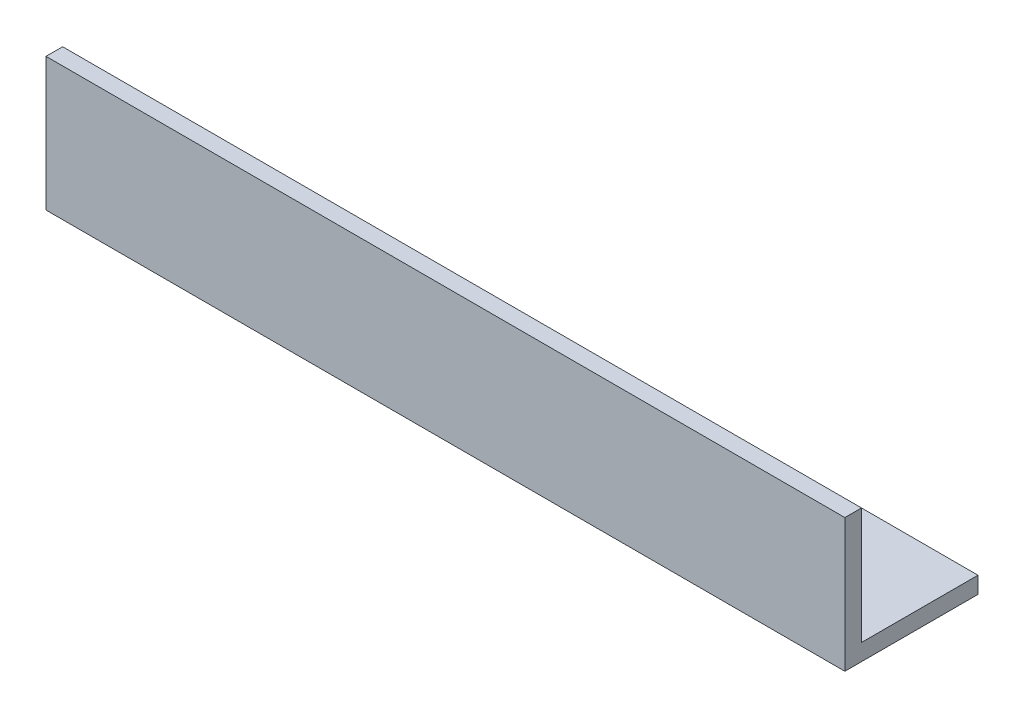
ISO-10303-21;
HEADER;
FILE_DESCRIPTION(('STEP AP214'),'2;1');
FILE_NAME('part.step','',(''),(''),'','','');
FILE_SCHEMA(('AUTOMOTIVE_DESIGN { 1 0 10303 214 1 1 1 1 }'));
ENDSEC;
DATA;
#1=APPLICATION_CONTEXT('core data for automotive mechanical design processes');
#2=APPLICATION_PROTOCOL_DEFINITION('international standard','automotive_design',2000,#1);
#3=PRODUCT_CONTEXT('',#1,'mechanical');
#4=PRODUCT('Part','Part','',(#3));
#5=PRODUCT_RELATED_PRODUCT_CATEGORY('part','',(#4));
#6=PRODUCT_DEFINITION_FORMATION('','',#4);
#7=PRODUCT_DEFINITION_CONTEXT('part definition',#1,'design');
#8=PRODUCT_DEFINITION('design','',#6,#7);
#9=PRODUCT_DEFINITION_SHAPE('','',#8);
#10=(LENGTH_UNIT() NAMED_UNIT(*) SI_UNIT(.MILLI.,.METRE.));
#11=(NAMED_UNIT(*) PLANE_ANGLE_UNIT() SI_UNIT($,.RADIAN.));
#12=(NAMED_UNIT(*) SI_UNIT($,.STERADIAN.) SOLID_ANGLE_UNIT());
#13=UNCERTAINTY_MEASURE_WITH_UNIT(LENGTH_MEASURE(1.E-05),#10,'distance_accuracy_value','');
#14=(GEOMETRIC_REPRESENTATION_CONTEXT(3) GLOBAL_UNCERTAINTY_ASSIGNED_CONTEXT((#13)) GLOBAL_UNIT_ASSIGNED_CONTEXT((#10,
#11,#12)) REPRESENTATION_CONTEXT('',''));
#15=CARTESIAN_POINT('',(0.,0.,0.));
#16=DIRECTION('',(0.,0.,1.));
#17=DIRECTION('',(1.,0.,0.));
#18=AXIS2_PLACEMENT_3D('',#15,#16,#17);
#19=CARTESIAN_POINT('',(304.8,0.,0.));
#20=DIRECTION('',(0.,0.,-1.));
#21=DIRECTION('',(-1.,0.,0.));
#22=AXIS2_PLACEMENT_3D('',#19,#20,#21);
#23=PLANE('',#22);
#24=DIRECTION('',(0.,-1.,0.));
#25=VECTOR('',#24,1.);
#26=CARTESIAN_POINT('',(0.,0.,0.));
#27=LINE('',#26,#25);
#28=CARTESIAN_POINT('',(0.,50.8,0.));
#29=VERTEX_POINT('',#28);
#30=CARTESIAN_POINT('',(0.,0.,0.));
#31=VERTEX_POINT('',#30);
#32=EDGE_CURVE('E171',#29,#31,#27,.T.);
#33=ORIENTED_EDGE('',*,*,#32,.T.);
#34=DIRECTION('',(-1.,0.,0.));
#35=VECTOR('',#34,1.);
#36=CARTESIAN_POINT('',(304.8,0.,0.));
#37=LINE('',#36,#35);
#38=CARTESIAN_POINT('',(304.8,0.,0.));
#39=VERTEX_POINT('',#38);
#40=EDGE_CURVE('E11',#39,#31,#37,.T.);
#41=ORIENTED_EDGE('',*,*,#40,.F.);
#42=DIRECTION('',(0.,-1.,0.));
#43=VECTOR('',#42,1.);
#44=CARTESIAN_POINT('',(304.8,0.,0.));
#45=LINE('',#44,#43);
#46=CARTESIAN_POINT('',(304.8,50.8,0.));
#47=VERTEX_POINT('',#46);
#48=EDGE_CURVE('E204',#47,#39,#45,.T.);
#49=ORIENTED_EDGE('',*,*,#48,.F.);
#50=DIRECTION('',(-1.,0.,0.));
#51=VECTOR('',#50,1.);
#52=CARTESIAN_POINT('',(304.8,50.8,0.));
#53=LINE('',#52,#51);
#54=EDGE_CURVE('E218',#47,#29,#53,.T.);
#55=ORIENTED_EDGE('',*,*,#54,.T.);
#56=EDGE_LOOP('',(#33,#41,#49,#55));
#57=FACE_BOUND('',#56,.T.);
#58=ADVANCED_FACE('F33',(#57),#23,.F.);
#59=CARTESIAN_POINT('',(304.8,0.,0.));
#60=DIRECTION('',(0.,1.,0.));
#61=DIRECTION('',(0.,0.,1.));
#62=AXIS2_PLACEMENT_3D('',#59,#60,#61);
#63=PLANE('',#62);
#64=DIRECTION('',(0.,0.,-1.));
#65=VECTOR('',#64,1.);
#66=CARTESIAN_POINT('',(53.975,0.,-42.8625));
#67=LINE('',#66,#65);
#68=CARTESIAN_POINT('',(53.975,0.,-17.4625));
#69=VERTEX_POINT('',#68);
#70=CARTESIAN_POINT('',(53.975,0.,-42.8625));
#71=VERTEX_POINT('',#70);
#72=EDGE_CURVE('E145',#69,#71,#67,.T.);
#73=ORIENTED_EDGE('',*,*,#72,.T.);
#74=CARTESIAN_POINT('',(50.8,0.,-42.8625));
#75=DIRECTION('',(0.,1.,0.));
#76=DIRECTION('',(0.,0.,1.));
#77=AXIS2_PLACEMENT_3D('',#74,#75,#76);
#78=CIRCLE('',#77,3.175);
#79=CARTESIAN_POINT('',(47.625,0.,-42.8625));
#80=VERTEX_POINT('',#79);
#81=EDGE_CURVE('E137',#71,#80,#78,.T.);
#82=ORIENTED_EDGE('',*,*,#81,.T.);
#83=DIRECTION('',(0.,0.,1.));
#84=VECTOR('',#83,1.);
#85=CARTESIAN_POINT('',(47.625,0.,-42.8625));
#86=LINE('',#85,#84);
#87=CARTESIAN_POINT('',(47.625,0.,-17.4625));
#88=VERTEX_POINT('',#87);
#89=EDGE_CURVE('E148',#80,#88,#86,.T.);
#90=ORIENTED_EDGE('',*,*,#89,.T.);
#91=CARTESIAN_POINT('',(50.8,0.,-17.4625));
#92=DIRECTION('',(0.,1.,0.));
#93=DIRECTION('',(0.,0.,1.));
#94=AXIS2_PLACEMENT_3D('',#91,#92,#93);
#95=CIRCLE('',#94,3.17499999999999);
#96=EDGE_CURVE('E47',#88,#69,#95,.T.);
#97=ORIENTED_EDGE('',*,*,#96,.T.);
#98=EDGE_LOOP('',(#73,#82,#90,#97));
#99=FACE_BOUND('',#98,.T.);
#100=DIRECTION('',(0.,0.,-1.));
#101=VECTOR('',#100,1.);
#102=CARTESIAN_POINT('',(257.175,0.,-42.8625));
#103=LINE('',#102,#101);
#104=CARTESIAN_POINT('',(257.175,0.,-17.4625));
#105=VERTEX_POINT('',#104);
#106=CARTESIAN_POINT('',(257.175,0.,-42.8625));
#107=VERTEX_POINT('',#106);
#108=EDGE_CURVE('E183',#105,#107,#103,.T.);
#109=ORIENTED_EDGE('',*,*,#108,.T.);
#110=CARTESIAN_POINT('',(254.,0.,-42.8625));
#111=DIRECTION('',(0.,1.,0.));
#112=DIRECTION('',(0.,0.,-1.));
#113=AXIS2_PLACEMENT_3D('',#110,#111,#112);
#114=CIRCLE('',#113,3.17499999999998);
#115=CARTESIAN_POINT('',(250.825,0.,-42.8625));
#116=VERTEX_POINT('',#115);
#117=EDGE_CURVE('E175',#107,#116,#114,.T.);
#118=ORIENTED_EDGE('',*,*,#117,.T.);
#119=DIRECTION('',(0.,0.,1.));
#120=VECTOR('',#119,1.);
#121=CARTESIAN_POINT('',(250.825,0.,-42.8625));
#122=LINE('',#121,#120);
#123=CARTESIAN_POINT('',(250.825,0.,-17.4625));
#124=VERTEX_POINT('',#123);
#125=EDGE_CURVE('E178',#116,#124,#122,.T.);
#126=ORIENTED_EDGE('',*,*,#125,.T.);
#127=CARTESIAN_POINT('',(254.,0.,-17.4625));
#128=DIRECTION('',(0.,1.,0.));
#129=DIRECTION('',(0.,0.,-1.));
#130=AXIS2_PLACEMENT_3D('',#127,#128,#129);
#131=CIRCLE('',#130,3.17499999999998);
#132=EDGE_CURVE('E55',#124,#105,#131,.T.);
#133=ORIENTED_EDGE('',*,*,#132,.T.);
#134=EDGE_LOOP('',(#109,#118,#126,#133));
#135=FACE_BOUND('',#134,.T.);
#136=DIRECTION('',(0.,0.,-1.));
#137=VECTOR('',#136,1.);
#138=CARTESIAN_POINT('',(0.,0.,0.));
#139=LINE('',#138,#137);
#140=CARTESIAN_POINT('',(0.,0.,-50.8));
#141=VERTEX_POINT('',#140);
#142=EDGE_CURVE('E221',#31,#141,#139,.T.);
#143=ORIENTED_EDGE('',*,*,#142,.T.);
#144=DIRECTION('',(-1.,0.,0.));
#145=VECTOR('',#144,1.);
#146=CARTESIAN_POINT('',(304.8,0.,-50.8));
#147=LINE('',#146,#145);
#148=CARTESIAN_POINT('',(304.8,0.,-50.8));
#149=VERTEX_POINT('',#148);
#150=EDGE_CURVE('E40',#149,#141,#147,.T.);
#151=ORIENTED_EDGE('',*,*,#150,.F.);
#152=DIRECTION('',(0.,0.,-1.));
#153=VECTOR('',#152,1.);
#154=CARTESIAN_POINT('',(304.8,0.,0.));
#155=LINE('',#154,#153);
#156=EDGE_CURVE('E207',#39,#149,#155,.T.);
#157=ORIENTED_EDGE('',*,*,#156,.F.);
#158=ORIENTED_EDGE('',*,*,#40,.T.);
#159=EDGE_LOOP('',(#143,#151,#157,#158));
#160=FACE_BOUND('',#159,.T.);
#161=ADVANCED_FACE('F152',(#99,#135,#160),#63,.F.);
#162=CARTESIAN_POINT('',(304.8,6.35,-50.8));
#163=DIRECTION('',(0.,0.,1.));
#164=DIRECTION('',(1.,0.,0.));
#165=AXIS2_PLACEMENT_3D('',#162,#163,#164);
#166=PLANE('',#165);
#167=DIRECTION('',(0.,1.,0.));
#168=VECTOR('',#167,1.);
#169=CARTESIAN_POINT('',(0.,6.35,-50.8));
#170=LINE('',#169,#168);
#171=CARTESIAN_POINT('',(0.,6.35,-50.8));
#172=VERTEX_POINT('',#171);
#173=EDGE_CURVE('E223',#141,#172,#170,.T.);
#174=ORIENTED_EDGE('',*,*,#173,.T.);
#175=DIRECTION('',(-1.,0.,0.));
#176=VECTOR('',#175,1.);
#177=CARTESIAN_POINT('',(304.8,6.35,-50.8));
#178=LINE('',#177,#176);
#179=CARTESIAN_POINT('',(304.8,6.35,-50.8));
#180=VERTEX_POINT('',#179);
#181=EDGE_CURVE('E238',#180,#172,#178,.T.);
#182=ORIENTED_EDGE('',*,*,#181,.F.);
#183=DIRECTION('',(0.,1.,0.));
#184=VECTOR('',#183,1.);
#185=CARTESIAN_POINT('',(304.8,6.35,-50.8));
#186=LINE('',#185,#184);
#187=EDGE_CURVE('E210',#149,#180,#186,.T.);
#188=ORIENTED_EDGE('',*,*,#187,.F.);
#189=ORIENTED_EDGE('',*,*,#150,.T.);
#190=EDGE_LOOP('',(#174,#182,#188,#189));
#191=FACE_BOUND('',#190,.T.);
#192=ADVANCED_FACE('F245',(#191),#166,.F.);
#193=CARTESIAN_POINT('',(304.8,6.35,-6.35));
#194=DIRECTION('',(0.,-1.,0.));
#195=DIRECTION('',(0.,0.,-1.));
#196=AXIS2_PLACEMENT_3D('',#193,#194,#195);
#197=PLANE('',#196);
#198=DIRECTION('',(0.,0.,1.));
#199=VECTOR('',#198,1.);
#200=CARTESIAN_POINT('',(47.625,6.35,-42.8625));
#201=LINE('',#200,#199);
#202=CARTESIAN_POINT('',(47.625,6.35,-42.8625));
#203=VERTEX_POINT('',#202);
#204=CARTESIAN_POINT('',(47.625,6.35,-17.4625));
#205=VERTEX_POINT('',#204);
#206=EDGE_CURVE('E164',#203,#205,#201,.T.);
#207=ORIENTED_EDGE('',*,*,#206,.F.);
#208=CARTESIAN_POINT('',(50.8,6.35,-42.8625));
#209=DIRECTION('',(0.,1.,0.));
#210=DIRECTION('',(0.,0.,1.));
#211=AXIS2_PLACEMENT_3D('',#208,#209,#210);
#212=CIRCLE('',#211,3.175);
#213=CARTESIAN_POINT('',(53.975,6.35,-42.8625));
#214=VERTEX_POINT('',#213);
#215=EDGE_CURVE('E140',#214,#203,#212,.T.);
#216=ORIENTED_EDGE('',*,*,#215,.F.);
#217=DIRECTION('',(0.,0.,-1.));
#218=VECTOR('',#217,1.);
#219=CARTESIAN_POINT('',(53.975,6.35,-42.8625));
#220=LINE('',#219,#218);
#221=CARTESIAN_POINT('',(53.975,6.35,-17.4625));
#222=VERTEX_POINT('',#221);
#223=EDGE_CURVE('E155',#222,#214,#220,.T.);
#224=ORIENTED_EDGE('',*,*,#223,.F.);
#225=CARTESIAN_POINT('',(50.8,6.35,-17.4625));
#226=DIRECTION('',(0.,1.,0.));
#227=DIRECTION('',(0.,0.,1.));
#228=AXIS2_PLACEMENT_3D('',#225,#226,#227);
#229=CIRCLE('',#228,3.17499999999999);
#230=EDGE_CURVE('E158',#205,#222,#229,.T.);
#231=ORIENTED_EDGE('',*,*,#230,.F.);
#232=EDGE_LOOP('',(#207,#216,#224,#231));
#233=FACE_BOUND('',#232,.T.);
#234=DIRECTION('',(0.,0.,1.));
#235=VECTOR('',#234,1.);
#236=CARTESIAN_POINT('',(250.825,6.35,-42.8625));
#237=LINE('',#236,#235);
#238=CARTESIAN_POINT('',(250.825,6.35,-42.8625));
#239=VERTEX_POINT('',#238);
#240=CARTESIAN_POINT('',(250.825,6.35,-17.4625));
#241=VERTEX_POINT('',#240);
#242=EDGE_CURVE('E189',#239,#241,#237,.T.);
#243=ORIENTED_EDGE('',*,*,#242,.F.);
#244=CARTESIAN_POINT('',(254.,6.35,-42.8625));
#245=DIRECTION('',(0.,1.,0.));
#246=DIRECTION('',(0.,0.,-1.));
#247=AXIS2_PLACEMENT_3D('',#244,#245,#246);
#248=CIRCLE('',#247,3.17499999999998);
#249=CARTESIAN_POINT('',(257.175,6.35,-42.8625));
#250=VERTEX_POINT('',#249);
#251=EDGE_CURVE('E187',#250,#239,#248,.T.);
#252=ORIENTED_EDGE('',*,*,#251,.F.);
#253=DIRECTION('',(0.,0.,-1.));
#254=VECTOR('',#253,1.);
#255=CARTESIAN_POINT('',(257.175,6.35,-42.8625));
#256=LINE('',#255,#254);
#257=CARTESIAN_POINT('',(257.175,6.35,-17.4625));
#258=VERTEX_POINT('',#257);
#259=EDGE_CURVE('E179',#258,#250,#256,.T.);
#260=ORIENTED_EDGE('',*,*,#259,.F.);
#261=CARTESIAN_POINT('',(254.,6.35,-17.4625));
#262=DIRECTION('',(0.,1.,0.));
#263=DIRECTION('',(0.,0.,-1.));
#264=AXIS2_PLACEMENT_3D('',#261,#262,#263);
#265=CIRCLE('',#264,3.17499999999998);
#266=EDGE_CURVE('E192',#241,#258,#265,.T.);
#267=ORIENTED_EDGE('',*,*,#266,.F.);
#268=EDGE_LOOP('',(#243,#252,#260,#267));
#269=FACE_BOUND('',#268,.T.);
#270=DIRECTION('',(0.,0.,1.));
#271=VECTOR('',#270,1.);
#272=CARTESIAN_POINT('',(0.,6.35,-6.35));
#273=LINE('',#272,#271);
#274=CARTESIAN_POINT('',(0.,6.35,-6.35));
#275=VERTEX_POINT('',#274);
#276=EDGE_CURVE('E225',#172,#275,#273,.T.);
#277=ORIENTED_EDGE('',*,*,#276,.T.);
#278=DIRECTION('',(-1.,0.,0.));
#279=VECTOR('',#278,1.);
#280=CARTESIAN_POINT('',(304.8,6.35,-6.35));
#281=LINE('',#280,#279);
#282=CARTESIAN_POINT('',(304.8,6.35,-6.35));
#283=VERTEX_POINT('',#282);
#284=EDGE_CURVE('E235',#283,#275,#281,.T.);
#285=ORIENTED_EDGE('',*,*,#284,.F.);
#286=DIRECTION('',(0.,0.,1.));
#287=VECTOR('',#286,1.);
#288=CARTESIAN_POINT('',(304.8,6.35,-6.35));
#289=LINE('',#288,#287);
#290=EDGE_CURVE('E212',#180,#283,#289,.T.);
#291=ORIENTED_EDGE('',*,*,#290,.F.);
#292=ORIENTED_EDGE('',*,*,#181,.T.);
#293=EDGE_LOOP('',(#277,#285,#291,#292));
#294=FACE_BOUND('',#293,.T.);
#295=ADVANCED_FACE('F256',(#233,#269,#294),#197,.F.);
#296=CARTESIAN_POINT('',(304.8,50.8,-6.35));
#297=DIRECTION('',(0.,0.,1.));
#298=DIRECTION('',(0.,-1.,0.));
#299=AXIS2_PLACEMENT_3D('',#296,#297,#298);
#300=PLANE('',#299);
#301=DIRECTION('',(0.,1.,0.));
#302=VECTOR('',#301,1.);
#303=CARTESIAN_POINT('',(0.,50.8,-6.35));
#304=LINE('',#303,#302);
#305=CARTESIAN_POINT('',(0.,50.8,-6.35));
#306=VERTEX_POINT('',#305);
#307=EDGE_CURVE('E227',#275,#306,#304,.T.);
#308=ORIENTED_EDGE('',*,*,#307,.T.);
#309=DIRECTION('',(-1.,0.,0.));
#310=VECTOR('',#309,1.);
#311=CARTESIAN_POINT('',(304.8,50.8,-6.35));
#312=LINE('',#311,#310);
#313=CARTESIAN_POINT('',(304.8,50.8,-6.35));
#314=VERTEX_POINT('',#313);
#315=EDGE_CURVE('E232',#314,#306,#312,.T.);
#316=ORIENTED_EDGE('',*,*,#315,.F.);
#317=DIRECTION('',(0.,1.,0.));
#318=VECTOR('',#317,1.);
#319=CARTESIAN_POINT('',(304.8,50.8,-6.35));
#320=LINE('',#319,#318);
#321=EDGE_CURVE('E214',#283,#314,#320,.T.);
#322=ORIENTED_EDGE('',*,*,#321,.F.);
#323=ORIENTED_EDGE('',*,*,#284,.T.);
#324=EDGE_LOOP('',(#308,#316,#322,#323));
#325=FACE_BOUND('',#324,.T.);
#326=ADVANCED_FACE('F260',(#325),#300,.F.);
#327=CARTESIAN_POINT('',(304.8,50.8,0.));
#328=DIRECTION('',(0.,-1.,0.));
#329=DIRECTION('',(0.,0.,-1.));
#330=AXIS2_PLACEMENT_3D('',#327,#328,#329);
#331=PLANE('',#330);
#332=DIRECTION('',(0.,0.,1.));
#333=VECTOR('',#332,1.);
#334=CARTESIAN_POINT('',(0.,50.8,0.));
#335=LINE('',#334,#333);
#336=EDGE_CURVE('E208',#306,#29,#335,.T.);
#337=ORIENTED_EDGE('',*,*,#336,.T.);
#338=ORIENTED_EDGE('',*,*,#54,.F.);
#339=DIRECTION('',(0.,0.,1.));
#340=VECTOR('',#339,1.);
#341=CARTESIAN_POINT('',(304.8,50.8,0.));
#342=LINE('',#341,#340);
#343=EDGE_CURVE('E216',#314,#47,#342,.T.);
#344=ORIENTED_EDGE('',*,*,#343,.F.);
#345=ORIENTED_EDGE('',*,*,#315,.T.);
#346=EDGE_LOOP('',(#337,#338,#344,#345));
#347=FACE_BOUND('',#346,.T.);
#348=ADVANCED_FACE('F270',(#347),#331,.F.);
#349=CARTESIAN_POINT('',(304.8,0.,0.));
#350=DIRECTION('',(-1.,0.,0.));
#351=DIRECTION('',(0.,0.,1.));
#352=AXIS2_PLACEMENT_3D('',#349,#350,#351);
#353=PLANE('',#352);
#354=ORIENTED_EDGE('',*,*,#48,.T.);
#355=ORIENTED_EDGE('',*,*,#156,.T.);
#356=ORIENTED_EDGE('',*,*,#187,.T.);
#357=ORIENTED_EDGE('',*,*,#290,.T.);
#358=ORIENTED_EDGE('',*,*,#321,.T.);
#359=ORIENTED_EDGE('',*,*,#343,.T.);
#360=EDGE_LOOP('',(#354,#355,#356,#357,#358,#359));
#361=FACE_BOUND('',#360,.T.);
#362=ADVANCED_FACE('F264',(#361),#353,.F.);
#363=CARTESIAN_POINT('',(0.,0.,0.));
#364=DIRECTION('',(-1.,0.,0.));
#365=DIRECTION('',(0.,0.,1.));
#366=AXIS2_PLACEMENT_3D('',#363,#364,#365);
#367=PLANE('',#366);
#368=ORIENTED_EDGE('',*,*,#32,.F.);
#369=ORIENTED_EDGE('',*,*,#336,.F.);
#370=ORIENTED_EDGE('',*,*,#307,.F.);
#371=ORIENTED_EDGE('',*,*,#276,.F.);
#372=ORIENTED_EDGE('',*,*,#173,.F.);
#373=ORIENTED_EDGE('',*,*,#142,.F.);
#374=EDGE_LOOP('',(#368,#369,#370,#371,#372,#373));
#375=FACE_BOUND('',#374,.T.);
#376=ADVANCED_FACE('F251',(#375),#367,.T.);
#377=CARTESIAN_POINT('',(254.,0.,-42.8625));
#378=DIRECTION('',(0.,1.,0.));
#379=DIRECTION('',(0.,0.,1.));
#380=AXIS2_PLACEMENT_3D('',#377,#378,#379);
#381=CYLINDRICAL_SURFACE('',#380,3.17499999999998);
#382=ORIENTED_EDGE('',*,*,#251,.T.);
#383=DIRECTION('',(0.,1.,0.));
#384=VECTOR('',#383,1.);
#385=CARTESIAN_POINT('',(250.825,0.,-42.8625));
#386=LINE('',#385,#384);
#387=EDGE_CURVE('E186',#116,#239,#386,.T.);
#388=ORIENTED_EDGE('',*,*,#387,.F.);
#389=ORIENTED_EDGE('',*,*,#117,.F.);
#390=DIRECTION('',(0.,1.,0.));
#391=VECTOR('',#390,1.);
#392=CARTESIAN_POINT('',(257.175,0.,-42.8625));
#393=LINE('',#392,#391);
#394=EDGE_CURVE('E165',#107,#250,#393,.T.);
#395=ORIENTED_EDGE('',*,*,#394,.T.);
#396=EDGE_LOOP('',(#382,#388,#389,#395));
#397=FACE_BOUND('',#396,.T.);
#398=ADVANCED_FACE('F304',(#397),#381,.F.);
#399=CARTESIAN_POINT('',(257.175,0.,-42.8625));
#400=DIRECTION('',(1.,0.,0.));
#401=DIRECTION('',(0.,0.,-1.));
#402=AXIS2_PLACEMENT_3D('',#399,#400,#401);
#403=PLANE('',#402);
#404=ORIENTED_EDGE('',*,*,#259,.T.);
#405=ORIENTED_EDGE('',*,*,#394,.F.);
#406=ORIENTED_EDGE('',*,*,#108,.F.);
#407=DIRECTION('',(0.,1.,0.));
#408=VECTOR('',#407,1.);
#409=CARTESIAN_POINT('',(257.175,0.,-17.4625));
#410=LINE('',#409,#408);
#411=EDGE_CURVE('E198',#105,#258,#410,.T.);
#412=ORIENTED_EDGE('',*,*,#411,.T.);
#413=EDGE_LOOP('',(#404,#405,#406,#412));
#414=FACE_BOUND('',#413,.T.);
#415=ADVANCED_FACE('F307',(#414),#403,.F.);
#416=CARTESIAN_POINT('',(254.,0.,-17.4625));
#417=DIRECTION('',(0.,1.,0.));
#418=DIRECTION('',(0.,0.,1.));
#419=AXIS2_PLACEMENT_3D('',#416,#417,#418);
#420=CYLINDRICAL_SURFACE('',#419,3.17499999999998);
#421=ORIENTED_EDGE('',*,*,#266,.T.);
#422=ORIENTED_EDGE('',*,*,#411,.F.);
#423=ORIENTED_EDGE('',*,*,#132,.F.);
#424=DIRECTION('',(0.,1.,0.));
#425=VECTOR('',#424,1.);
#426=CARTESIAN_POINT('',(250.825,0.,-17.4625));
#427=LINE('',#426,#425);
#428=EDGE_CURVE('E200',#124,#241,#427,.T.);
#429=ORIENTED_EDGE('',*,*,#428,.T.);
#430=EDGE_LOOP('',(#421,#422,#423,#429));
#431=FACE_BOUND('',#430,.T.);
#432=ADVANCED_FACE('F308',(#431),#420,.F.);
#433=CARTESIAN_POINT('',(250.825,0.,-42.8625));
#434=DIRECTION('',(-1.,0.,0.));
#435=DIRECTION('',(0.,0.,1.));
#436=AXIS2_PLACEMENT_3D('',#433,#434,#435);
#437=PLANE('',#436);
#438=ORIENTED_EDGE('',*,*,#242,.T.);
#439=ORIENTED_EDGE('',*,*,#428,.F.);
#440=ORIENTED_EDGE('',*,*,#125,.F.);
#441=ORIENTED_EDGE('',*,*,#387,.T.);
#442=EDGE_LOOP('',(#438,#439,#440,#441));
#443=FACE_BOUND('',#442,.T.);
#444=ADVANCED_FACE('F300',(#443),#437,.F.);
#445=CARTESIAN_POINT('',(50.8,0.,-42.8625));
#446=DIRECTION('',(0.,1.,0.));
#447=DIRECTION('',(0.,0.,1.));
#448=AXIS2_PLACEMENT_3D('',#445,#446,#447);
#449=CYLINDRICAL_SURFACE('',#448,3.175);
#450=ORIENTED_EDGE('',*,*,#215,.T.);
#451=DIRECTION('',(0.,1.,0.));
#452=VECTOR('',#451,1.);
#453=CARTESIAN_POINT('',(47.625,0.,-42.8625));
#454=LINE('',#453,#452);
#455=EDGE_CURVE('E133',#80,#203,#454,.T.);
#456=ORIENTED_EDGE('',*,*,#455,.F.);
#457=ORIENTED_EDGE('',*,*,#81,.F.);
#458=DIRECTION('',(0.,1.,0.));
#459=VECTOR('',#458,1.);
#460=CARTESIAN_POINT('',(53.975,0.,-42.8625));
#461=LINE('',#460,#459);
#462=EDGE_CURVE('E169',#71,#214,#461,.T.);
#463=ORIENTED_EDGE('',*,*,#462,.T.);
#464=EDGE_LOOP('',(#450,#456,#457,#463));
#465=FACE_BOUND('',#464,.T.);
#466=ADVANCED_FACE('F135',(#465),#449,.F.);
#467=CARTESIAN_POINT('',(53.975,0.,-42.8625));
#468=DIRECTION('',(1.,0.,0.));
#469=DIRECTION('',(0.,0.,-1.));
#470=AXIS2_PLACEMENT_3D('',#467,#468,#469);
#471=PLANE('',#470);
#472=ORIENTED_EDGE('',*,*,#223,.T.);
#473=ORIENTED_EDGE('',*,*,#462,.F.);
#474=ORIENTED_EDGE('',*,*,#72,.F.);
#475=DIRECTION('',(0.,1.,0.));
#476=VECTOR('',#475,1.);
#477=CARTESIAN_POINT('',(53.975,0.,-17.4625));
#478=LINE('',#477,#476);
#479=EDGE_CURVE('E172',#69,#222,#478,.T.);
#480=ORIENTED_EDGE('',*,*,#479,.T.);
#481=EDGE_LOOP('',(#472,#473,#474,#480));
#482=FACE_BOUND('',#481,.T.);
#483=ADVANCED_FACE('F352',(#482),#471,.F.);
#484=CARTESIAN_POINT('',(50.8,0.,-17.4625));
#485=DIRECTION('',(0.,1.,0.));
#486=DIRECTION('',(0.,0.,1.));
#487=AXIS2_PLACEMENT_3D('',#484,#485,#486);
#488=CYLINDRICAL_SURFACE('',#487,3.17499999999999);
#489=ORIENTED_EDGE('',*,*,#230,.T.);
#490=ORIENTED_EDGE('',*,*,#479,.F.);
#491=ORIENTED_EDGE('',*,*,#96,.F.);
#492=DIRECTION('',(0.,1.,0.));
#493=VECTOR('',#492,1.);
#494=CARTESIAN_POINT('',(47.625,0.,-17.4625));
#495=LINE('',#494,#493);
#496=EDGE_CURVE('E144',#88,#205,#495,.T.);
#497=ORIENTED_EDGE('',*,*,#496,.T.);
#498=EDGE_LOOP('',(#489,#490,#491,#497));
#499=FACE_BOUND('',#498,.T.);
#500=ADVANCED_FACE('F360',(#499),#488,.F.);
#501=CARTESIAN_POINT('',(47.625,0.,-42.8625));
#502=DIRECTION('',(-1.,0.,0.));
#503=DIRECTION('',(0.,0.,1.));
#504=AXIS2_PLACEMENT_3D('',#501,#502,#503);
#505=PLANE('',#504);
#506=ORIENTED_EDGE('',*,*,#206,.T.);
#507=ORIENTED_EDGE('',*,*,#496,.F.);
#508=ORIENTED_EDGE('',*,*,#89,.F.);
#509=ORIENTED_EDGE('',*,*,#455,.T.);
#510=EDGE_LOOP('',(#506,#507,#508,#509));
#511=FACE_BOUND('',#510,.T.);
#512=ADVANCED_FACE('F149',(#511),#505,.F.);
#513=CLOSED_SHELL('',(#58,#161,#192,#295,#326,#348,#362,#376,#398,#415,#432,#444,#466,#483,#500,#512));
#514=MANIFOLD_SOLID_BREP('B2',#513);
#515=ADVANCED_BREP_SHAPE_REPRESENTATION('',(#18,#514),#14);
#516=SHAPE_DEFINITION_REPRESENTATION(#9,#515);
ENDSEC;
END-ISO-10303-21;
